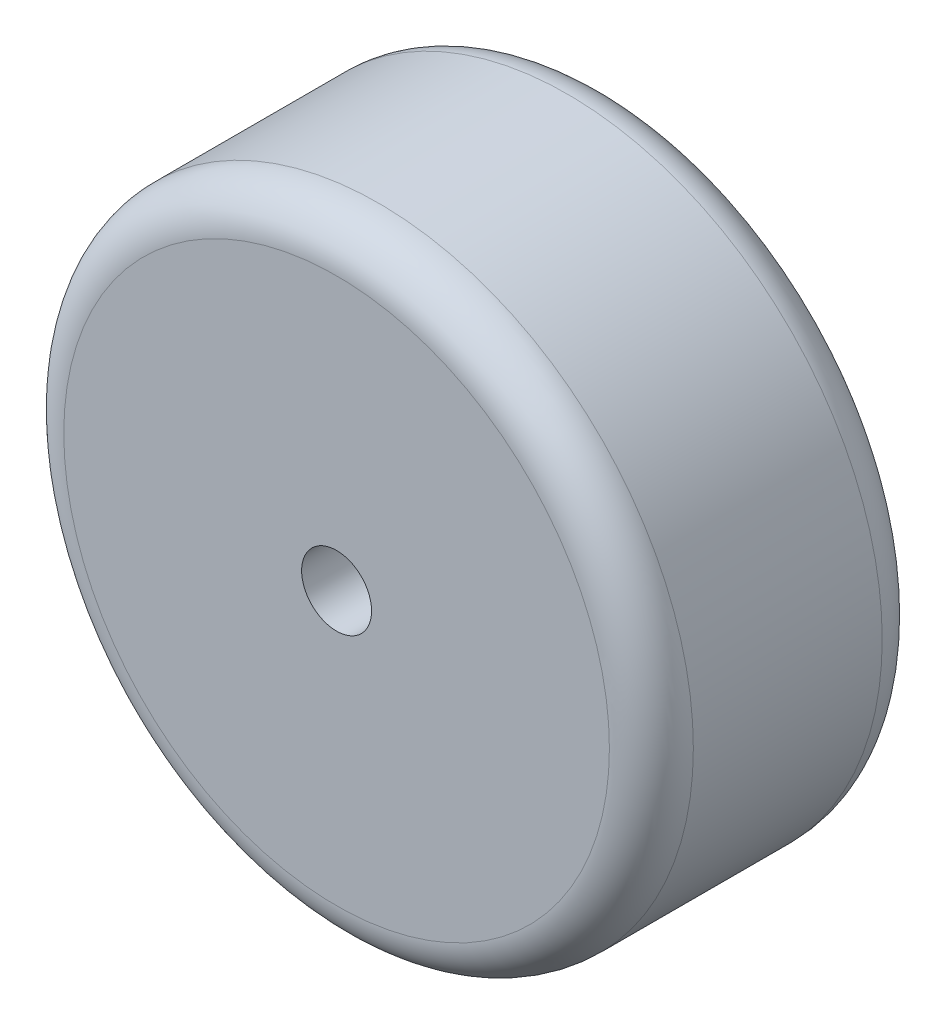
ISO-10303-21;
HEADER;
FILE_DESCRIPTION(('STEP AP214'),'2;1');
FILE_NAME('part.step','',(''),(''),'','','');
FILE_SCHEMA(('AUTOMOTIVE_DESIGN { 1 0 10303 214 1 1 1 1 }'));
ENDSEC;
DATA;
#1=APPLICATION_CONTEXT('core data for automotive mechanical design processes');
#2=APPLICATION_PROTOCOL_DEFINITION('international standard','automotive_design',2000,#1);
#3=PRODUCT_CONTEXT('',#1,'mechanical');
#4=PRODUCT('Part','Part','',(#3));
#5=PRODUCT_RELATED_PRODUCT_CATEGORY('part','',(#4));
#6=PRODUCT_DEFINITION_FORMATION('','',#4);
#7=PRODUCT_DEFINITION_CONTEXT('part definition',#1,'design');
#8=PRODUCT_DEFINITION('design','',#6,#7);
#9=PRODUCT_DEFINITION_SHAPE('','',#8);
#10=(LENGTH_UNIT() NAMED_UNIT(*) SI_UNIT(.MILLI.,.METRE.));
#11=(NAMED_UNIT(*) PLANE_ANGLE_UNIT() SI_UNIT($,.RADIAN.));
#12=(NAMED_UNIT(*) SI_UNIT($,.STERADIAN.) SOLID_ANGLE_UNIT());
#13=UNCERTAINTY_MEASURE_WITH_UNIT(LENGTH_MEASURE(1.E-05),#10,'distance_accuracy_value','');
#14=(GEOMETRIC_REPRESENTATION_CONTEXT(3) GLOBAL_UNCERTAINTY_ASSIGNED_CONTEXT((#13)) GLOBAL_UNIT_ASSIGNED_CONTEXT((#10,
#11,#12)) REPRESENTATION_CONTEXT('',''));
#15=CARTESIAN_POINT('',(0.,0.,0.));
#16=DIRECTION('',(0.,0.,1.));
#17=DIRECTION('',(1.,0.,0.));
#18=AXIS2_PLACEMENT_3D('',#15,#16,#17);
#19=CARTESIAN_POINT('',(0.,0.,14.859));
#20=DIRECTION('',(0.,0.,-1.));
#21=DIRECTION('',(-1.,0.,0.));
#22=AXIS2_PLACEMENT_3D('',#19,#20,#21);
#23=CYLINDRICAL_SURFACE('',#22,17.145);
#24=CARTESIAN_POINT('',(0.,0.,2.286));
#25=DIRECTION('',(0.,0.,1.));
#26=DIRECTION('',(1.,0.,0.));
#27=AXIS2_PLACEMENT_3D('',#24,#25,#26);
#28=CIRCLE('',#27,17.145);
#29=CARTESIAN_POINT('',(17.145,0.,2.286));
#30=VERTEX_POINT('',#29);
#31=EDGE_CURVE('E48',#30,#30,#28,.T.);
#32=ORIENTED_EDGE('',*,*,#31,.T.);
#33=EDGE_LOOP('',(#32));
#34=FACE_BOUND('',#33,.T.);
#35=CARTESIAN_POINT('',(0.,0.,12.573));
#36=DIRECTION('',(0.,0.,1.));
#37=DIRECTION('',(1.,0.,0.));
#38=AXIS2_PLACEMENT_3D('',#35,#36,#37);
#39=CIRCLE('',#38,17.145);
#40=CARTESIAN_POINT('',(17.145,0.,12.573));
#41=VERTEX_POINT('',#40);
#42=EDGE_CURVE('E52',#41,#41,#39,.F.);
#43=ORIENTED_EDGE('',*,*,#42,.T.);
#44=EDGE_LOOP('',(#43));
#45=FACE_BOUND('',#44,.T.);
#46=ADVANCED_FACE('F37',(#34,#45),#23,.T.);
#47=CARTESIAN_POINT('',(0.,0.,14.859));
#48=DIRECTION('',(0.,0.,1.));
#49=DIRECTION('',(1.,0.,0.));
#50=AXIS2_PLACEMENT_3D('',#47,#48,#49);
#51=PLANE('',#50);
#52=CARTESIAN_POINT('',(0.,0.,14.859));
#53=DIRECTION('',(0.,0.,1.));
#54=DIRECTION('',(1.,0.,0.));
#55=AXIS2_PLACEMENT_3D('',#52,#53,#54);
#56=CIRCLE('',#55,1.905);
#57=CARTESIAN_POINT('',(1.905,0.,14.859));
#58=VERTEX_POINT('',#57);
#59=EDGE_CURVE('E58',#58,#58,#56,.T.);
#60=ORIENTED_EDGE('',*,*,#59,.F.);
#61=EDGE_LOOP('',(#60));
#62=FACE_BOUND('',#61,.T.);
#63=CARTESIAN_POINT('',(0.,0.,14.859));
#64=DIRECTION('',(0.,0.,1.));
#65=DIRECTION('',(1.,0.,0.));
#66=AXIS2_PLACEMENT_3D('',#63,#64,#65);
#67=CIRCLE('',#66,14.859);
#68=CARTESIAN_POINT('',(14.859,0.,14.859));
#69=VERTEX_POINT('',#68);
#70=EDGE_CURVE('E10',#69,#69,#67,.T.);
#71=ORIENTED_EDGE('',*,*,#70,.T.);
#72=EDGE_LOOP('',(#71));
#73=FACE_BOUND('',#72,.T.);
#74=ADVANCED_FACE('F72',(#62,#73),#51,.T.);
#75=CARTESIAN_POINT('',(0.,0.,0.));
#76=DIRECTION('',(0.,0.,1.));
#77=DIRECTION('',(1.,0.,0.));
#78=AXIS2_PLACEMENT_3D('',#75,#76,#77);
#79=PLANE('',#78);
#80=CARTESIAN_POINT('',(0.,0.,0.));
#81=DIRECTION('',(0.,0.,1.));
#82=DIRECTION('',(1.,0.,0.));
#83=AXIS2_PLACEMENT_3D('',#80,#81,#82);
#84=CIRCLE('',#83,1.905);
#85=CARTESIAN_POINT('',(1.905,0.,0.));
#86=VERTEX_POINT('',#85);
#87=EDGE_CURVE('E57',#86,#86,#84,.T.);
#88=ORIENTED_EDGE('',*,*,#87,.T.);
#89=EDGE_LOOP('',(#88));
#90=FACE_BOUND('',#89,.T.);
#91=CARTESIAN_POINT('',(0.,0.,0.));
#92=DIRECTION('',(0.,0.,1.));
#93=DIRECTION('',(1.,0.,0.));
#94=AXIS2_PLACEMENT_3D('',#91,#92,#93);
#95=CIRCLE('',#94,14.859);
#96=CARTESIAN_POINT('',(14.859,0.,0.));
#97=VERTEX_POINT('',#96);
#98=EDGE_CURVE('E44',#97,#97,#95,.F.);
#99=ORIENTED_EDGE('',*,*,#98,.T.);
#100=EDGE_LOOP('',(#99));
#101=FACE_BOUND('',#100,.T.);
#102=ADVANCED_FACE('F64',(#90,#101),#79,.F.);
#103=CARTESIAN_POINT('',(0.,0.,2.286));
#104=DIRECTION('',(0.,0.,1.));
#105=DIRECTION('',(1.,0.,0.));
#106=AXIS2_PLACEMENT_3D('',#103,#104,#105);
#107=TOROIDAL_SURFACE('',#106,14.859,2.286);
#108=ORIENTED_EDGE('',*,*,#98,.F.);
#109=EDGE_LOOP('',(#108));
#110=FACE_BOUND('',#109,.T.);
#111=ORIENTED_EDGE('',*,*,#31,.F.);
#112=EDGE_LOOP('',(#111));
#113=FACE_BOUND('',#112,.T.);
#114=ADVANCED_FACE('F79',(#110,#113),#107,.T.);
#115=CARTESIAN_POINT('',(0.,0.,12.573));
#116=DIRECTION('',(0.,0.,1.));
#117=DIRECTION('',(1.,0.,0.));
#118=AXIS2_PLACEMENT_3D('',#115,#116,#117);
#119=TOROIDAL_SURFACE('',#118,14.859,2.286);
#120=ORIENTED_EDGE('',*,*,#42,.F.);
#121=EDGE_LOOP('',(#120));
#122=FACE_BOUND('',#121,.T.);
#123=ORIENTED_EDGE('',*,*,#70,.F.);
#124=EDGE_LOOP('',(#123));
#125=FACE_BOUND('',#124,.T.);
#126=ADVANCED_FACE('F39',(#122,#125),#119,.T.);
#127=CARTESIAN_POINT('',(0.,0.,0.));
#128=DIRECTION('',(0.,0.,1.));
#129=DIRECTION('',(1.,0.,0.));
#130=AXIS2_PLACEMENT_3D('',#127,#128,#129);
#131=CYLINDRICAL_SURFACE('',#130,1.905);
#132=ORIENTED_EDGE('',*,*,#87,.F.);
#133=EDGE_LOOP('',(#132));
#134=FACE_BOUND('',#133,.T.);
#135=ORIENTED_EDGE('',*,*,#59,.T.);
#136=EDGE_LOOP('',(#135));
#137=FACE_BOUND('',#136,.T.);
#138=ADVANCED_FACE('F66',(#134,#137),#131,.F.);
#139=CLOSED_SHELL('',(#46,#74,#102,#114,#126,#138));
#140=MANIFOLD_SOLID_BREP('B2',#139);
#141=ADVANCED_BREP_SHAPE_REPRESENTATION('',(#18,#140),#14);
#142=SHAPE_DEFINITION_REPRESENTATION(#9,#141);
ENDSEC;
END-ISO-10303-21;
